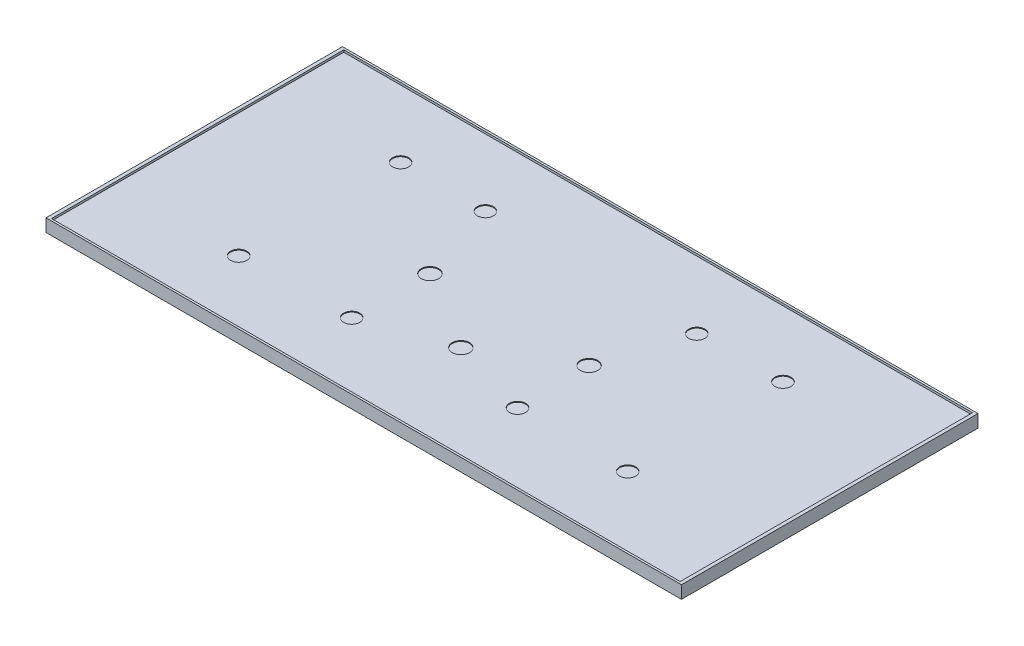
ISO-10303-21;
HEADER;
FILE_DESCRIPTION(('STEP AP214'),'2;1');
FILE_NAME('part.step','',(''),(''),'','','');
FILE_SCHEMA(('AUTOMOTIVE_DESIGN { 1 0 10303 214 1 1 1 1 }'));
ENDSEC;
DATA;
#1=APPLICATION_CONTEXT('core data for automotive mechanical design processes');
#2=APPLICATION_PROTOCOL_DEFINITION('international standard','automotive_design',2000,#1);
#3=PRODUCT_CONTEXT('',#1,'mechanical');
#4=PRODUCT('Part','Part','',(#3));
#5=PRODUCT_RELATED_PRODUCT_CATEGORY('part','',(#4));
#6=PRODUCT_DEFINITION_FORMATION('','',#4);
#7=PRODUCT_DEFINITION_CONTEXT('part definition',#1,'design');
#8=PRODUCT_DEFINITION('design','',#6,#7);
#9=PRODUCT_DEFINITION_SHAPE('','',#8);
#10=(LENGTH_UNIT() NAMED_UNIT(*) SI_UNIT(.MILLI.,.METRE.));
#11=(NAMED_UNIT(*) PLANE_ANGLE_UNIT() SI_UNIT($,.RADIAN.));
#12=(NAMED_UNIT(*) SI_UNIT($,.STERADIAN.) SOLID_ANGLE_UNIT());
#13=UNCERTAINTY_MEASURE_WITH_UNIT(LENGTH_MEASURE(1.E-05),#10,'distance_accuracy_value','');
#14=(GEOMETRIC_REPRESENTATION_CONTEXT(3) GLOBAL_UNCERTAINTY_ASSIGNED_CONTEXT((#13)) GLOBAL_UNIT_ASSIGNED_CONTEXT((#10,
#11,#12)) REPRESENTATION_CONTEXT('',''));
#15=CARTESIAN_POINT('',(0.,0.,0.));
#16=DIRECTION('',(0.,0.,1.));
#17=DIRECTION('',(1.,0.,0.));
#18=AXIS2_PLACEMENT_3D('',#15,#16,#17);
#19=CARTESIAN_POINT('',(-302.727398066436,30.,-483.03033717774));
#20=DIRECTION('',(1.,0.,0.));
#21=DIRECTION('',(0.,0.,-1.));
#22=AXIS2_PLACEMENT_3D('',#19,#20,#21);
#23=PLANE('',#22);
#24=DIRECTION('',(0.,0.,1.));
#25=VECTOR('',#24,1.);
#26=CARTESIAN_POINT('',(-302.727398066436,0.,-483.03033717774));
#27=LINE('',#26,#25);
#28=CARTESIAN_POINT('',(-302.727398066436,0.,-483.03033717774));
#29=VERTEX_POINT('',#28);
#30=CARTESIAN_POINT('',(-302.727398066436,0.,216.96966282226));
#31=VERTEX_POINT('',#30);
#32=EDGE_CURVE('E148',#29,#31,#27,.T.);
#33=ORIENTED_EDGE('',*,*,#32,.T.);
#34=DIRECTION('',(0.,-1.,0.));
#35=VECTOR('',#34,1.);
#36=CARTESIAN_POINT('',(-302.727398066436,30.,216.96966282226));
#37=LINE('',#36,#35);
#38=CARTESIAN_POINT('',(-302.727398066436,30.,216.96966282226));
#39=VERTEX_POINT('',#38);
#40=EDGE_CURVE('E11',#39,#31,#37,.T.);
#41=ORIENTED_EDGE('',*,*,#40,.F.);
#42=DIRECTION('',(0.,0.,1.));
#43=VECTOR('',#42,1.);
#44=CARTESIAN_POINT('',(-302.727398066436,30.,-483.03033717774));
#45=LINE('',#44,#43);
#46=CARTESIAN_POINT('',(-302.727398066436,30.,-483.03033717774));
#47=VERTEX_POINT('',#46);
#48=EDGE_CURVE('E152',#47,#39,#45,.T.);
#49=ORIENTED_EDGE('',*,*,#48,.F.);
#50=DIRECTION('',(0.,-1.,0.));
#51=VECTOR('',#50,1.);
#52=CARTESIAN_POINT('',(-302.727398066436,30.,-483.03033717774));
#53=LINE('',#52,#51);
#54=EDGE_CURVE('E158',#47,#29,#53,.T.);
#55=ORIENTED_EDGE('',*,*,#54,.T.);
#56=EDGE_LOOP('',(#33,#41,#49,#55));
#57=FACE_BOUND('',#56,.T.);
#58=ADVANCED_FACE('F36',(#57),#23,.F.);
#59=CARTESIAN_POINT('',(-302.727398066436,30.,216.96966282226));
#60=DIRECTION('',(0.,0.,-1.));
#61=DIRECTION('',(-1.,0.,0.));
#62=AXIS2_PLACEMENT_3D('',#59,#60,#61);
#63=PLANE('',#62);
#64=DIRECTION('',(1.,0.,0.));
#65=VECTOR('',#64,1.);
#66=CARTESIAN_POINT('',(-302.727398066436,0.,216.96966282226));
#67=LINE('',#66,#65);
#68=CARTESIAN_POINT('',(1197.27260193356,0.,216.96966282226));
#69=VERTEX_POINT('',#68);
#70=EDGE_CURVE('E161',#31,#69,#67,.T.);
#71=ORIENTED_EDGE('',*,*,#70,.T.);
#72=DIRECTION('',(0.,-1.,0.));
#73=VECTOR('',#72,1.);
#74=CARTESIAN_POINT('',(1197.27260193356,30.,216.96966282226));
#75=LINE('',#74,#73);
#76=CARTESIAN_POINT('',(1197.27260193356,30.,216.96966282226));
#77=VERTEX_POINT('',#76);
#78=EDGE_CURVE('E43',#77,#69,#75,.T.);
#79=ORIENTED_EDGE('',*,*,#78,.F.);
#80=DIRECTION('',(1.,0.,0.));
#81=VECTOR('',#80,1.);
#82=CARTESIAN_POINT('',(-302.727398066436,30.,216.96966282226));
#83=LINE('',#82,#81);
#84=EDGE_CURVE('E87',#39,#77,#83,.T.);
#85=ORIENTED_EDGE('',*,*,#84,.F.);
#86=ORIENTED_EDGE('',*,*,#40,.T.);
#87=EDGE_LOOP('',(#71,#79,#85,#86));
#88=FACE_BOUND('',#87,.T.);
#89=ADVANCED_FACE('F190',(#88),#63,.F.);
#90=CARTESIAN_POINT('',(1197.27260193356,30.,-483.03033717774));
#91=DIRECTION('',(-1.,0.,0.));
#92=DIRECTION('',(0.,0.,1.));
#93=AXIS2_PLACEMENT_3D('',#90,#91,#92);
#94=PLANE('',#93);
#95=DIRECTION('',(0.,0.,-1.));
#96=VECTOR('',#95,1.);
#97=CARTESIAN_POINT('',(1197.27260193356,0.,-483.03033717774));
#98=LINE('',#97,#96);
#99=CARTESIAN_POINT('',(1197.27260193356,0.,-483.03033717774));
#100=VERTEX_POINT('',#99);
#101=EDGE_CURVE('E163',#69,#100,#98,.T.);
#102=ORIENTED_EDGE('',*,*,#101,.T.);
#103=DIRECTION('',(0.,-1.,0.));
#104=VECTOR('',#103,1.);
#105=CARTESIAN_POINT('',(1197.27260193356,30.,-483.03033717774));
#106=LINE('',#105,#104);
#107=CARTESIAN_POINT('',(1197.27260193356,30.,-483.03033717774));
#108=VERTEX_POINT('',#107);
#109=EDGE_CURVE('E167',#108,#100,#106,.T.);
#110=ORIENTED_EDGE('',*,*,#109,.F.);
#111=DIRECTION('',(0.,0.,-1.));
#112=VECTOR('',#111,1.);
#113=CARTESIAN_POINT('',(1197.27260193356,30.,-483.03033717774));
#114=LINE('',#113,#112);
#115=EDGE_CURVE('E155',#77,#108,#114,.T.);
#116=ORIENTED_EDGE('',*,*,#115,.F.);
#117=ORIENTED_EDGE('',*,*,#78,.T.);
#118=EDGE_LOOP('',(#102,#110,#116,#117));
#119=FACE_BOUND('',#118,.T.);
#120=ADVANCED_FACE('F172',(#119),#94,.F.);
#121=CARTESIAN_POINT('',(-302.727398066436,30.,-483.03033717774));
#122=DIRECTION('',(0.,0.,1.));
#123=DIRECTION('',(1.,0.,0.));
#124=AXIS2_PLACEMENT_3D('',#121,#122,#123);
#125=PLANE('',#124);
#126=DIRECTION('',(-1.,0.,0.));
#127=VECTOR('',#126,1.);
#128=CARTESIAN_POINT('',(-302.727398066436,0.,-483.03033717774));
#129=LINE('',#128,#127);
#130=EDGE_CURVE('E80',#100,#29,#129,.T.);
#131=ORIENTED_EDGE('',*,*,#130,.T.);
#132=ORIENTED_EDGE('',*,*,#54,.F.);
#133=DIRECTION('',(-1.,0.,0.));
#134=VECTOR('',#133,1.);
#135=CARTESIAN_POINT('',(-302.727398066436,30.,-483.03033717774));
#136=LINE('',#135,#134);
#137=EDGE_CURVE('E59',#108,#47,#136,.T.);
#138=ORIENTED_EDGE('',*,*,#137,.F.);
#139=ORIENTED_EDGE('',*,*,#109,.T.);
#140=EDGE_LOOP('',(#131,#132,#138,#139));
#141=FACE_BOUND('',#140,.T.);
#142=ADVANCED_FACE('F180',(#141),#125,.F.);
#143=CARTESIAN_POINT('',(0.,30.,0.));
#144=DIRECTION('',(0.,1.,0.));
#145=DIRECTION('',(0.,0.,1.));
#146=AXIS2_PLACEMENT_3D('',#143,#144,#145);
#147=PLANE('',#146);
#148=DIRECTION('',(0.,0.,1.));
#149=VECTOR('',#148,1.);
#150=CARTESIAN_POINT('',(-294.727398066436,30.,-478.03033717774));
#151=LINE('',#150,#149);
#152=CARTESIAN_POINT('',(-294.727398066436,30.,-478.03033717774));
#153=VERTEX_POINT('',#152);
#154=CARTESIAN_POINT('',(-294.727398066436,30.,211.96966282226));
#155=VERTEX_POINT('',#154);
#156=EDGE_CURVE('E50',#153,#155,#151,.T.);
#157=ORIENTED_EDGE('',*,*,#156,.F.);
#158=DIRECTION('',(-1.,0.,0.));
#159=VECTOR('',#158,1.);
#160=CARTESIAN_POINT('',(-294.727398066436,30.,-478.03033717774));
#161=LINE('',#160,#159);
#162=CARTESIAN_POINT('',(1189.27260193356,30.,-478.03033717774));
#163=VERTEX_POINT('',#162);
#164=EDGE_CURVE('E129',#163,#153,#161,.T.);
#165=ORIENTED_EDGE('',*,*,#164,.F.);
#166=DIRECTION('',(0.,0.,-1.));
#167=VECTOR('',#166,1.);
#168=CARTESIAN_POINT('',(1189.27260193356,30.,-478.03033717774));
#169=LINE('',#168,#167);
#170=CARTESIAN_POINT('',(1189.27260193356,30.,211.96966282226));
#171=VERTEX_POINT('',#170);
#172=EDGE_CURVE('E132',#171,#163,#169,.T.);
#173=ORIENTED_EDGE('',*,*,#172,.F.);
#174=DIRECTION('',(1.,0.,0.));
#175=VECTOR('',#174,1.);
#176=CARTESIAN_POINT('',(-294.727398066436,30.,211.96966282226));
#177=LINE('',#176,#175);
#178=EDGE_CURVE('E141',#155,#171,#177,.T.);
#179=ORIENTED_EDGE('',*,*,#178,.F.);
#180=EDGE_LOOP('',(#157,#165,#173,#179));
#181=FACE_BOUND('',#180,.T.);
#182=ORIENTED_EDGE('',*,*,#48,.T.);
#183=ORIENTED_EDGE('',*,*,#84,.T.);
#184=ORIENTED_EDGE('',*,*,#115,.T.);
#185=ORIENTED_EDGE('',*,*,#137,.T.);
#186=EDGE_LOOP('',(#182,#183,#184,#185));
#187=FACE_BOUND('',#186,.T.);
#188=ADVANCED_FACE('F182',(#181,#187),#147,.T.);
#189=CARTESIAN_POINT('',(0.,0.,0.));
#190=DIRECTION('',(0.,1.,0.));
#191=DIRECTION('',(0.,0.,1.));
#192=AXIS2_PLACEMENT_3D('',#189,#190,#191);
#193=PLANE('',#192);
#194=ORIENTED_EDGE('',*,*,#32,.F.);
#195=ORIENTED_EDGE('',*,*,#130,.F.);
#196=ORIENTED_EDGE('',*,*,#101,.F.);
#197=ORIENTED_EDGE('',*,*,#70,.F.);
#198=EDGE_LOOP('',(#194,#195,#196,#197));
#199=FACE_BOUND('',#198,.T.);
#200=ADVANCED_FACE('F176',(#199),#193,.F.);
#201=CARTESIAN_POINT('',(-294.727398066436,25.,-478.03033717774));
#202=DIRECTION('',(-1.,0.,0.));
#203=DIRECTION('',(0.,0.,1.));
#204=AXIS2_PLACEMENT_3D('',#201,#202,#203);
#205=PLANE('',#204);
#206=ORIENTED_EDGE('',*,*,#156,.T.);
#207=DIRECTION('',(0.,1.,0.));
#208=VECTOR('',#207,1.);
#209=CARTESIAN_POINT('',(-294.727398066436,25.,211.96966282226));
#210=LINE('',#209,#208);
#211=CARTESIAN_POINT('',(-294.727398066436,25.,211.96966282226));
#212=VERTEX_POINT('',#211);
#213=EDGE_CURVE('E107',#212,#155,#210,.T.);
#214=ORIENTED_EDGE('',*,*,#213,.F.);
#215=DIRECTION('',(0.,0.,1.));
#216=VECTOR('',#215,1.);
#217=CARTESIAN_POINT('',(-294.727398066436,25.,-478.03033717774));
#218=LINE('',#217,#216);
#219=CARTESIAN_POINT('',(-294.727398066436,25.,-478.03033717774));
#220=VERTEX_POINT('',#219);
#221=EDGE_CURVE('E111',#220,#212,#218,.T.);
#222=ORIENTED_EDGE('',*,*,#221,.F.);
#223=DIRECTION('',(0.,1.,0.));
#224=VECTOR('',#223,1.);
#225=CARTESIAN_POINT('',(-294.727398066436,25.,-478.03033717774));
#226=LINE('',#225,#224);
#227=EDGE_CURVE('E146',#220,#153,#226,.T.);
#228=ORIENTED_EDGE('',*,*,#227,.T.);
#229=EDGE_LOOP('',(#206,#214,#222,#228));
#230=FACE_BOUND('',#229,.T.);
#231=ADVANCED_FACE('F109',(#230),#205,.F.);
#232=CARTESIAN_POINT('',(-294.727398066436,25.,-478.03033717774));
#233=DIRECTION('',(0.,0.,-1.));
#234=DIRECTION('',(-1.,0.,0.));
#235=AXIS2_PLACEMENT_3D('',#232,#233,#234);
#236=PLANE('',#235);
#237=ORIENTED_EDGE('',*,*,#164,.T.);
#238=ORIENTED_EDGE('',*,*,#227,.F.);
#239=DIRECTION('',(-1.,0.,0.));
#240=VECTOR('',#239,1.);
#241=CARTESIAN_POINT('',(-294.727398066436,25.,-478.03033717774));
#242=LINE('',#241,#240);
#243=CARTESIAN_POINT('',(1189.27260193356,25.,-478.03033717774));
#244=VERTEX_POINT('',#243);
#245=EDGE_CURVE('E117',#244,#220,#242,.T.);
#246=ORIENTED_EDGE('',*,*,#245,.F.);
#247=DIRECTION('',(0.,1.,0.));
#248=VECTOR('',#247,1.);
#249=CARTESIAN_POINT('',(1189.27260193356,25.,-478.03033717774));
#250=LINE('',#249,#248);
#251=EDGE_CURVE('E149',#244,#163,#250,.T.);
#252=ORIENTED_EDGE('',*,*,#251,.T.);
#253=EDGE_LOOP('',(#237,#238,#246,#252));
#254=FACE_BOUND('',#253,.T.);
#255=ADVANCED_FACE('F246',(#254),#236,.F.);
#256=CARTESIAN_POINT('',(1189.27260193356,25.,-478.03033717774));
#257=DIRECTION('',(1.,0.,0.));
#258=DIRECTION('',(0.,0.,-1.));
#259=AXIS2_PLACEMENT_3D('',#256,#257,#258);
#260=PLANE('',#259);
#261=ORIENTED_EDGE('',*,*,#172,.T.);
#262=ORIENTED_EDGE('',*,*,#251,.F.);
#263=DIRECTION('',(0.,0.,-1.));
#264=VECTOR('',#263,1.);
#265=CARTESIAN_POINT('',(1189.27260193356,25.,-478.03033717774));
#266=LINE('',#265,#264);
#267=CARTESIAN_POINT('',(1189.27260193356,25.,211.96966282226));
#268=VERTEX_POINT('',#267);
#269=EDGE_CURVE('E125',#268,#244,#266,.T.);
#270=ORIENTED_EDGE('',*,*,#269,.F.);
#271=DIRECTION('',(0.,1.,0.));
#272=VECTOR('',#271,1.);
#273=CARTESIAN_POINT('',(1189.27260193356,25.,211.96966282226));
#274=LINE('',#273,#272);
#275=EDGE_CURVE('E116',#268,#171,#274,.T.);
#276=ORIENTED_EDGE('',*,*,#275,.T.);
#277=EDGE_LOOP('',(#261,#262,#270,#276));
#278=FACE_BOUND('',#277,.T.);
#279=ADVANCED_FACE('F254',(#278),#260,.F.);
#280=CARTESIAN_POINT('',(-294.727398066436,25.,211.96966282226));
#281=DIRECTION('',(0.,0.,1.));
#282=DIRECTION('',(1.,0.,0.));
#283=AXIS2_PLACEMENT_3D('',#280,#281,#282);
#284=PLANE('',#283);
#285=ORIENTED_EDGE('',*,*,#178,.T.);
#286=ORIENTED_EDGE('',*,*,#275,.F.);
#287=DIRECTION('',(1.,0.,0.));
#288=VECTOR('',#287,1.);
#289=CARTESIAN_POINT('',(-294.727398066436,25.,211.96966282226));
#290=LINE('',#289,#288);
#291=EDGE_CURVE('E120',#212,#268,#290,.T.);
#292=ORIENTED_EDGE('',*,*,#291,.F.);
#293=ORIENTED_EDGE('',*,*,#213,.T.);
#294=EDGE_LOOP('',(#285,#286,#292,#293));
#295=FACE_BOUND('',#294,.T.);
#296=ADVANCED_FACE('F121',(#295),#284,.F.);
#297=CARTESIAN_POINT('',(0.,25.,0.));
#298=DIRECTION('',(0.,1.,0.));
#299=DIRECTION('',(0.,0.,1.));
#300=AXIS2_PLACEMENT_3D('',#297,#298,#299);
#301=PLANE('',#300);
#302=CARTESIAN_POINT('',(897.272601933564,25.,-322.611122669244));
#303=DIRECTION('',(0.,1.,0.));
#304=DIRECTION('',(0.,0.,1.));
#305=AXIS2_PLACEMENT_3D('',#302,#303,#304);
#306=CIRCLE('',#305,19.);
#307=CARTESIAN_POINT('',(897.272601933564,25.,-303.611122669244));
#308=VERTEX_POINT('',#307);
#309=EDGE_CURVE('E526',#308,#308,#306,.T.);
#310=ORIENTED_EDGE('',*,*,#309,.F.);
#311=EDGE_LOOP('',(#310));
#312=FACE_BOUND('',#311,.T.);
#313=CARTESIAN_POINT('',(259.572601933564,25.,-127.154489333953));
#314=DIRECTION('',(0.,1.,0.));
#315=DIRECTION('',(0.,0.,1.));
#316=AXIS2_PLACEMENT_3D('',#313,#314,#315);
#317=CIRCLE('',#316,20.5);
#318=CARTESIAN_POINT('',(259.572601933564,25.,-106.654489333953));
#319=VERTEX_POINT('',#318);
#320=EDGE_CURVE('E525',#319,#319,#317,.T.);
#321=ORIENTED_EDGE('',*,*,#320,.F.);
#322=EDGE_LOOP('',(#321));
#323=FACE_BOUND('',#322,.T.);
#324=CARTESIAN_POINT('',(-2.72739806643568,25.,61.9696628222598));
#325=DIRECTION('',(0.,1.,0.));
#326=DIRECTION('',(0.,0.,1.));
#327=AXIS2_PLACEMENT_3D('',#324,#325,#326);
#328=CIRCLE('',#327,19.);
#329=CARTESIAN_POINT('',(-2.72739806643568,25.,80.9696628222598));
#330=VERTEX_POINT('',#329);
#331=EDGE_CURVE('E596',#330,#330,#328,.T.);
#332=ORIENTED_EDGE('',*,*,#331,.F.);
#333=EDGE_LOOP('',(#332));
#334=FACE_BOUND('',#333,.T.);
#335=CARTESIAN_POINT('',(-2.72739806643574,25.,-320.105430205764));
#336=DIRECTION('',(0.,1.,0.));
#337=DIRECTION('',(0.,0.,1.));
#338=AXIS2_PLACEMENT_3D('',#335,#336,#337);
#339=CIRCLE('',#338,19.);
#340=CARTESIAN_POINT('',(-2.72739806643574,25.,-301.105430205764));
#341=VERTEX_POINT('',#340);
#342=EDGE_CURVE('E590',#341,#341,#339,.T.);
#343=ORIENTED_EDGE('',*,*,#342,.F.);
#344=EDGE_LOOP('',(#343));
#345=FACE_BOUND('',#344,.T.);
#346=CARTESIAN_POINT('',(697.300508301462,25.,-319.270199384604));
#347=DIRECTION('',(0.,1.,0.));
#348=DIRECTION('',(0.,0.,1.));
#349=AXIS2_PLACEMENT_3D('',#346,#347,#348);
#350=CIRCLE('',#349,19.);
#351=CARTESIAN_POINT('',(697.300508301462,25.,-300.270199384604));
#352=VERTEX_POINT('',#351);
#353=EDGE_CURVE('E553',#352,#352,#350,.T.);
#354=ORIENTED_EDGE('',*,*,#353,.F.);
#355=EDGE_LOOP('',(#354));
#356=FACE_BOUND('',#355,.T.);
#357=CARTESIAN_POINT('',(257.272601933564,25.,55.3776030434392));
#358=DIRECTION('',(0.,1.,0.));
#359=DIRECTION('',(0.,0.,1.));
#360=AXIS2_PLACEMENT_3D('',#357,#358,#359);
#361=CIRCLE('',#360,19.);
#362=CARTESIAN_POINT('',(257.272601933564,25.,74.3776030434392));
#363=VERTEX_POINT('',#362);
#364=EDGE_CURVE('E539',#363,#363,#361,.T.);
#365=ORIENTED_EDGE('',*,*,#364,.F.);
#366=EDGE_LOOP('',(#365));
#367=FACE_BOUND('',#366,.T.);
#368=CARTESIAN_POINT('',(637.272601933564,25.,43.8826387628666));
#369=DIRECTION('',(0.,1.,0.));
#370=DIRECTION('',(0.,0.,1.));
#371=AXIS2_PLACEMENT_3D('',#368,#369,#370);
#372=CIRCLE('',#371,19.);
#373=CARTESIAN_POINT('',(637.272601933564,25.,62.8826387628666));
#374=VERTEX_POINT('',#373);
#375=EDGE_CURVE('E540',#374,#374,#372,.T.);
#376=ORIENTED_EDGE('',*,*,#375,.F.);
#377=EDGE_LOOP('',(#376));
#378=FACE_BOUND('',#377,.T.);
#379=CARTESIAN_POINT('',(634.95492099322,25.,-127.154489333953));
#380=DIRECTION('',(0.,1.,0.));
#381=DIRECTION('',(0.,0.,1.));
#382=AXIS2_PLACEMENT_3D('',#379,#380,#381);
#383=CIRCLE('',#382,20.5000000000001);
#384=CARTESIAN_POINT('',(634.95492099322,25.,-106.654489333953));
#385=VERTEX_POINT('',#384);
#386=EDGE_CURVE('E546',#385,#385,#383,.T.);
#387=ORIENTED_EDGE('',*,*,#386,.F.);
#388=EDGE_LOOP('',(#387));
#389=FACE_BOUND('',#388,.T.);
#390=CARTESIAN_POINT('',(447.263761463392,25.,-12.3850307034069));
#391=DIRECTION('',(0.,1.,0.));
#392=DIRECTION('',(0.,0.,1.));
#393=AXIS2_PLACEMENT_3D('',#390,#391,#392);
#394=CIRCLE('',#393,20.5);
#395=CARTESIAN_POINT('',(447.263761463392,25.,8.11496929659318));
#396=VERTEX_POINT('',#395);
#397=EDGE_CURVE('E577',#396,#396,#394,.T.);
#398=ORIENTED_EDGE('',*,*,#397,.F.);
#399=EDGE_LOOP('',(#398));
#400=FACE_BOUND('',#399,.T.);
#401=CARTESIAN_POINT('',(897.272601933564,25.,43.8826387628666));
#402=DIRECTION('',(0.,1.,0.));
#403=DIRECTION('',(0.,0.,1.));
#404=AXIS2_PLACEMENT_3D('',#401,#402,#403);
#405=CIRCLE('',#404,19.);
#406=CARTESIAN_POINT('',(897.272601933564,25.,62.8826387628666));
#407=VERTEX_POINT('',#406);
#408=EDGE_CURVE('E580',#407,#407,#405,.T.);
#409=ORIENTED_EDGE('',*,*,#408,.F.);
#410=EDGE_LOOP('',(#409));
#411=FACE_BOUND('',#410,.T.);
#412=CARTESIAN_POINT('',(197.272601933564,25.,-320.105430205764));
#413=DIRECTION('',(0.,1.,0.));
#414=DIRECTION('',(0.,0.,1.));
#415=AXIS2_PLACEMENT_3D('',#412,#413,#414);
#416=CIRCLE('',#415,19.);
#417=CARTESIAN_POINT('',(197.272601933564,25.,-301.105430205764));
#418=VERTEX_POINT('',#417);
#419=EDGE_CURVE('E135',#418,#418,#416,.T.);
#420=ORIENTED_EDGE('',*,*,#419,.F.);
#421=EDGE_LOOP('',(#420));
#422=FACE_BOUND('',#421,.T.);
#423=ORIENTED_EDGE('',*,*,#221,.T.);
#424=ORIENTED_EDGE('',*,*,#291,.T.);
#425=ORIENTED_EDGE('',*,*,#269,.T.);
#426=ORIENTED_EDGE('',*,*,#245,.T.);
#427=EDGE_LOOP('',(#423,#424,#425,#426));
#428=FACE_BOUND('',#427,.T.);
#429=ADVANCED_FACE('F127',(#312,#323,#334,#345,#356,#367,#378,#389,#400,#411,#422,#428),#301,.T.);
#430=CARTESIAN_POINT('',(197.272601933564,23.,-320.105430205764));
#431=DIRECTION('',(0.,1.,0.));
#432=DIRECTION('',(0.,0.,1.));
#433=AXIS2_PLACEMENT_3D('',#430,#431,#432);
#434=CYLINDRICAL_SURFACE('',#433,19.);
#435=CARTESIAN_POINT('',(197.272601933564,23.,-320.105430205764));
#436=DIRECTION('',(0.,1.,0.));
#437=DIRECTION('',(0.,0.,1.));
#438=AXIS2_PLACEMENT_3D('',#435,#436,#437);
#439=CIRCLE('',#438,19.);
#440=CARTESIAN_POINT('',(197.272601933564,23.,-301.105430205764));
#441=VERTEX_POINT('',#440);
#442=EDGE_CURVE('E142',#441,#441,#439,.T.);
#443=ORIENTED_EDGE('',*,*,#442,.F.);
#444=EDGE_LOOP('',(#443));
#445=FACE_BOUND('',#444,.T.);
#446=ORIENTED_EDGE('',*,*,#419,.T.);
#447=EDGE_LOOP('',(#446));
#448=FACE_BOUND('',#447,.T.);
#449=ADVANCED_FACE('F278',(#445,#448),#434,.F.);
#450=CARTESIAN_POINT('',(197.272601933564,23.,-320.105430205764));
#451=DIRECTION('',(0.,1.,0.));
#452=DIRECTION('',(0.,0.,1.));
#453=AXIS2_PLACEMENT_3D('',#450,#451,#452);
#454=PLANE('',#453);
#455=ORIENTED_EDGE('',*,*,#442,.T.);
#456=EDGE_LOOP('',(#455));
#457=FACE_BOUND('',#456,.T.);
#458=ADVANCED_FACE('F287',(#457),#454,.T.);
#459=CARTESIAN_POINT('',(897.272601933564,23.,43.8826387628666));
#460=DIRECTION('',(0.,1.,0.));
#461=DIRECTION('',(0.,0.,1.));
#462=AXIS2_PLACEMENT_3D('',#459,#460,#461);
#463=CYLINDRICAL_SURFACE('',#462,19.);
#464=CARTESIAN_POINT('',(897.272601933564,23.,43.8826387628666));
#465=DIRECTION('',(0.,1.,0.));
#466=DIRECTION('',(0.,0.,1.));
#467=AXIS2_PLACEMENT_3D('',#464,#465,#466);
#468=CIRCLE('',#467,19.);
#469=CARTESIAN_POINT('',(897.272601933564,23.,62.8826387628666));
#470=VERTEX_POINT('',#469);
#471=EDGE_CURVE('E582',#470,#470,#468,.T.);
#472=ORIENTED_EDGE('',*,*,#471,.F.);
#473=EDGE_LOOP('',(#472));
#474=FACE_BOUND('',#473,.T.);
#475=ORIENTED_EDGE('',*,*,#408,.T.);
#476=EDGE_LOOP('',(#475));
#477=FACE_BOUND('',#476,.T.);
#478=ADVANCED_FACE('F296',(#474,#477),#463,.F.);
#479=CARTESIAN_POINT('',(897.272601933564,23.,43.8826387628666));
#480=DIRECTION('',(0.,1.,0.));
#481=DIRECTION('',(0.,0.,1.));
#482=AXIS2_PLACEMENT_3D('',#479,#480,#481);
#483=PLANE('',#482);
#484=ORIENTED_EDGE('',*,*,#471,.T.);
#485=EDGE_LOOP('',(#484));
#486=FACE_BOUND('',#485,.T.);
#487=ADVANCED_FACE('F305',(#486),#483,.T.);
#488=CARTESIAN_POINT('',(447.263761463392,23.,-12.3850307034069));
#489=DIRECTION('',(0.,1.,0.));
#490=DIRECTION('',(0.,0.,1.));
#491=AXIS2_PLACEMENT_3D('',#488,#489,#490);
#492=CYLINDRICAL_SURFACE('',#491,20.5);
#493=CARTESIAN_POINT('',(447.263761463392,23.,-12.3850307034069));
#494=DIRECTION('',(0.,1.,0.));
#495=DIRECTION('',(0.,0.,1.));
#496=AXIS2_PLACEMENT_3D('',#493,#494,#495);
#497=CIRCLE('',#496,20.5);
#498=CARTESIAN_POINT('',(447.263761463392,23.,8.11496929659318));
#499=VERTEX_POINT('',#498);
#500=EDGE_CURVE('E532',#499,#499,#497,.T.);
#501=ORIENTED_EDGE('',*,*,#500,.F.);
#502=EDGE_LOOP('',(#501));
#503=FACE_BOUND('',#502,.T.);
#504=ORIENTED_EDGE('',*,*,#397,.T.);
#505=EDGE_LOOP('',(#504));
#506=FACE_BOUND('',#505,.T.);
#507=ADVANCED_FACE('F314',(#503,#506),#492,.F.);
#508=CARTESIAN_POINT('',(447.263761463392,23.,-12.3850307034069));
#509=DIRECTION('',(0.,1.,0.));
#510=DIRECTION('',(0.,0.,1.));
#511=AXIS2_PLACEMENT_3D('',#508,#509,#510);
#512=PLANE('',#511);
#513=ORIENTED_EDGE('',*,*,#500,.T.);
#514=EDGE_LOOP('',(#513));
#515=FACE_BOUND('',#514,.T.);
#516=ADVANCED_FACE('F323',(#515),#512,.T.);
#517=CARTESIAN_POINT('',(634.95492099322,23.,-127.154489333953));
#518=DIRECTION('',(0.,1.,0.));
#519=DIRECTION('',(0.,0.,1.));
#520=AXIS2_PLACEMENT_3D('',#517,#518,#519);
#521=CYLINDRICAL_SURFACE('',#520,20.5000000000001);
#522=CARTESIAN_POINT('',(634.95492099322,23.,-127.154489333953));
#523=DIRECTION('',(0.,1.,0.));
#524=DIRECTION('',(0.,0.,1.));
#525=AXIS2_PLACEMENT_3D('',#522,#523,#524);
#526=CIRCLE('',#525,20.5000000000001);
#527=CARTESIAN_POINT('',(634.95492099322,23.,-106.654489333953));
#528=VERTEX_POINT('',#527);
#529=EDGE_CURVE('E543',#528,#528,#526,.T.);
#530=ORIENTED_EDGE('',*,*,#529,.F.);
#531=EDGE_LOOP('',(#530));
#532=FACE_BOUND('',#531,.T.);
#533=ORIENTED_EDGE('',*,*,#386,.T.);
#534=EDGE_LOOP('',(#533));
#535=FACE_BOUND('',#534,.T.);
#536=ADVANCED_FACE('F332',(#532,#535),#521,.F.);
#537=CARTESIAN_POINT('',(634.95492099322,23.,-127.154489333953));
#538=DIRECTION('',(0.,1.,0.));
#539=DIRECTION('',(0.,0.,1.));
#540=AXIS2_PLACEMENT_3D('',#537,#538,#539);
#541=PLANE('',#540);
#542=ORIENTED_EDGE('',*,*,#529,.T.);
#543=EDGE_LOOP('',(#542));
#544=FACE_BOUND('',#543,.T.);
#545=ADVANCED_FACE('F341',(#544),#541,.T.);
#546=CARTESIAN_POINT('',(637.272601933564,23.,43.8826387628666));
#547=DIRECTION('',(0.,1.,0.));
#548=DIRECTION('',(0.,0.,1.));
#549=AXIS2_PLACEMENT_3D('',#546,#547,#548);
#550=CYLINDRICAL_SURFACE('',#549,19.);
#551=CARTESIAN_POINT('',(637.272601933564,23.,43.8826387628666));
#552=DIRECTION('',(0.,1.,0.));
#553=DIRECTION('',(0.,0.,1.));
#554=AXIS2_PLACEMENT_3D('',#551,#552,#553);
#555=CIRCLE('',#554,19.);
#556=CARTESIAN_POINT('',(637.272601933564,23.,62.8826387628666));
#557=VERTEX_POINT('',#556);
#558=EDGE_CURVE('E536',#557,#557,#555,.T.);
#559=ORIENTED_EDGE('',*,*,#558,.F.);
#560=EDGE_LOOP('',(#559));
#561=FACE_BOUND('',#560,.T.);
#562=ORIENTED_EDGE('',*,*,#375,.T.);
#563=EDGE_LOOP('',(#562));
#564=FACE_BOUND('',#563,.T.);
#565=ADVANCED_FACE('F350',(#561,#564),#550,.F.);
#566=CARTESIAN_POINT('',(637.272601933564,23.,43.8826387628666));
#567=DIRECTION('',(0.,1.,0.));
#568=DIRECTION('',(0.,0.,1.));
#569=AXIS2_PLACEMENT_3D('',#566,#567,#568);
#570=PLANE('',#569);
#571=ORIENTED_EDGE('',*,*,#558,.T.);
#572=EDGE_LOOP('',(#571));
#573=FACE_BOUND('',#572,.T.);
#574=ADVANCED_FACE('F359',(#573),#570,.T.);
#575=CARTESIAN_POINT('',(257.272601933564,23.,55.3776030434392));
#576=DIRECTION('',(0.,1.,0.));
#577=DIRECTION('',(0.,0.,1.));
#578=AXIS2_PLACEMENT_3D('',#575,#576,#577);
#579=CYLINDRICAL_SURFACE('',#578,19.);
#580=CARTESIAN_POINT('',(257.272601933564,23.,55.3776030434392));
#581=DIRECTION('',(0.,1.,0.));
#582=DIRECTION('',(0.,0.,1.));
#583=AXIS2_PLACEMENT_3D('',#580,#581,#582);
#584=CIRCLE('',#583,19.);
#585=CARTESIAN_POINT('',(257.272601933564,23.,74.3776030434392));
#586=VERTEX_POINT('',#585);
#587=EDGE_CURVE('E556',#586,#586,#584,.T.);
#588=ORIENTED_EDGE('',*,*,#587,.F.);
#589=EDGE_LOOP('',(#588));
#590=FACE_BOUND('',#589,.T.);
#591=ORIENTED_EDGE('',*,*,#364,.T.);
#592=EDGE_LOOP('',(#591));
#593=FACE_BOUND('',#592,.T.);
#594=ADVANCED_FACE('F368',(#590,#593),#579,.F.);
#595=CARTESIAN_POINT('',(257.272601933564,23.,55.3776030434392));
#596=DIRECTION('',(0.,1.,0.));
#597=DIRECTION('',(0.,0.,1.));
#598=AXIS2_PLACEMENT_3D('',#595,#596,#597);
#599=PLANE('',#598);
#600=ORIENTED_EDGE('',*,*,#587,.T.);
#601=EDGE_LOOP('',(#600));
#602=FACE_BOUND('',#601,.T.);
#603=ADVANCED_FACE('F377',(#602),#599,.T.);
#604=CARTESIAN_POINT('',(697.300508301462,23.,-319.270199384604));
#605=DIRECTION('',(0.,1.,0.));
#606=DIRECTION('',(0.,0.,1.));
#607=AXIS2_PLACEMENT_3D('',#604,#605,#606);
#608=CYLINDRICAL_SURFACE('',#607,19.);
#609=CARTESIAN_POINT('',(697.300508301462,23.,-319.270199384604));
#610=DIRECTION('',(0.,1.,0.));
#611=DIRECTION('',(0.,0.,1.));
#612=AXIS2_PLACEMENT_3D('',#609,#610,#611);
#613=CIRCLE('',#612,19.);
#614=CARTESIAN_POINT('',(697.300508301462,23.,-300.270199384604));
#615=VERTEX_POINT('',#614);
#616=EDGE_CURVE('E550',#615,#615,#613,.T.);
#617=ORIENTED_EDGE('',*,*,#616,.F.);
#618=EDGE_LOOP('',(#617));
#619=FACE_BOUND('',#618,.T.);
#620=ORIENTED_EDGE('',*,*,#353,.T.);
#621=EDGE_LOOP('',(#620));
#622=FACE_BOUND('',#621,.T.);
#623=ADVANCED_FACE('F386',(#619,#622),#608,.F.);
#624=CARTESIAN_POINT('',(697.300508301462,23.,-319.270199384604));
#625=DIRECTION('',(0.,1.,0.));
#626=DIRECTION('',(0.,0.,1.));
#627=AXIS2_PLACEMENT_3D('',#624,#625,#626);
#628=PLANE('',#627);
#629=ORIENTED_EDGE('',*,*,#616,.T.);
#630=EDGE_LOOP('',(#629));
#631=FACE_BOUND('',#630,.T.);
#632=ADVANCED_FACE('F395',(#631),#628,.T.);
#633=CARTESIAN_POINT('',(-2.72739806643574,23.,-320.105430205764));
#634=DIRECTION('',(0.,1.,0.));
#635=DIRECTION('',(0.,0.,1.));
#636=AXIS2_PLACEMENT_3D('',#633,#634,#635);
#637=CYLINDRICAL_SURFACE('',#636,19.);
#638=CARTESIAN_POINT('',(-2.72739806643574,23.,-320.105430205764));
#639=DIRECTION('',(0.,1.,0.));
#640=DIRECTION('',(0.,0.,1.));
#641=AXIS2_PLACEMENT_3D('',#638,#639,#640);
#642=CIRCLE('',#641,19.);
#643=CARTESIAN_POINT('',(-2.72739806643574,23.,-301.105430205764));
#644=VERTEX_POINT('',#643);
#645=EDGE_CURVE('E549',#644,#644,#642,.T.);
#646=ORIENTED_EDGE('',*,*,#645,.F.);
#647=EDGE_LOOP('',(#646));
#648=FACE_BOUND('',#647,.T.);
#649=ORIENTED_EDGE('',*,*,#342,.T.);
#650=EDGE_LOOP('',(#649));
#651=FACE_BOUND('',#650,.T.);
#652=ADVANCED_FACE('F404',(#648,#651),#637,.F.);
#653=CARTESIAN_POINT('',(-2.72739806643574,23.,-320.105430205764));
#654=DIRECTION('',(0.,1.,0.));
#655=DIRECTION('',(0.,0.,1.));
#656=AXIS2_PLACEMENT_3D('',#653,#654,#655);
#657=PLANE('',#656);
#658=ORIENTED_EDGE('',*,*,#645,.T.);
#659=EDGE_LOOP('',(#658));
#660=FACE_BOUND('',#659,.T.);
#661=ADVANCED_FACE('F413',(#660),#657,.T.);
#662=CARTESIAN_POINT('',(-2.72739806643568,23.,61.9696628222598));
#663=DIRECTION('',(0.,1.,0.));
#664=DIRECTION('',(0.,0.,1.));
#665=AXIS2_PLACEMENT_3D('',#662,#663,#664);
#666=CYLINDRICAL_SURFACE('',#665,19.);
#667=CARTESIAN_POINT('',(-2.72739806643568,23.,61.9696628222598));
#668=DIRECTION('',(0.,1.,0.));
#669=DIRECTION('',(0.,0.,1.));
#670=AXIS2_PLACEMENT_3D('',#667,#668,#669);
#671=CIRCLE('',#670,19.);
#672=CARTESIAN_POINT('',(-2.72739806643568,23.,80.9696628222598));
#673=VERTEX_POINT('',#672);
#674=EDGE_CURVE('E593',#673,#673,#671,.T.);
#675=ORIENTED_EDGE('',*,*,#674,.F.);
#676=EDGE_LOOP('',(#675));
#677=FACE_BOUND('',#676,.T.);
#678=ORIENTED_EDGE('',*,*,#331,.T.);
#679=EDGE_LOOP('',(#678));
#680=FACE_BOUND('',#679,.T.);
#681=ADVANCED_FACE('F422',(#677,#680),#666,.F.);
#682=CARTESIAN_POINT('',(-2.72739806643568,23.,61.9696628222598));
#683=DIRECTION('',(0.,1.,0.));
#684=DIRECTION('',(0.,0.,1.));
#685=AXIS2_PLACEMENT_3D('',#682,#683,#684);
#686=PLANE('',#685);
#687=ORIENTED_EDGE('',*,*,#674,.T.);
#688=EDGE_LOOP('',(#687));
#689=FACE_BOUND('',#688,.T.);
#690=ADVANCED_FACE('F431',(#689),#686,.T.);
#691=CARTESIAN_POINT('',(259.572601933564,23.,-127.154489333953));
#692=DIRECTION('',(0.,1.,0.));
#693=DIRECTION('',(0.,0.,1.));
#694=AXIS2_PLACEMENT_3D('',#691,#692,#693);
#695=CYLINDRICAL_SURFACE('',#694,20.5);
#696=CARTESIAN_POINT('',(259.572601933564,23.,-127.154489333953));
#697=DIRECTION('',(0.,1.,0.));
#698=DIRECTION('',(0.,0.,1.));
#699=AXIS2_PLACEMENT_3D('',#696,#697,#698);
#700=CIRCLE('',#699,20.5);
#701=CARTESIAN_POINT('',(259.572601933564,23.,-106.654489333953));
#702=VERTEX_POINT('',#701);
#703=EDGE_CURVE('E529',#702,#702,#700,.T.);
#704=ORIENTED_EDGE('',*,*,#703,.F.);
#705=EDGE_LOOP('',(#704));
#706=FACE_BOUND('',#705,.T.);
#707=ORIENTED_EDGE('',*,*,#320,.T.);
#708=EDGE_LOOP('',(#707));
#709=FACE_BOUND('',#708,.T.);
#710=ADVANCED_FACE('F440',(#706,#709),#695,.F.);
#711=CARTESIAN_POINT('',(259.572601933564,23.,-127.154489333953));
#712=DIRECTION('',(0.,1.,0.));
#713=DIRECTION('',(0.,0.,1.));
#714=AXIS2_PLACEMENT_3D('',#711,#712,#713);
#715=PLANE('',#714);
#716=ORIENTED_EDGE('',*,*,#703,.T.);
#717=EDGE_LOOP('',(#716));
#718=FACE_BOUND('',#717,.T.);
#719=ADVANCED_FACE('F449',(#718),#715,.T.);
#720=CARTESIAN_POINT('',(897.272601933564,23.,-322.611122669244));
#721=DIRECTION('',(0.,1.,0.));
#722=DIRECTION('',(0.,0.,1.));
#723=AXIS2_PLACEMENT_3D('',#720,#721,#722);
#724=CYLINDRICAL_SURFACE('',#723,19.);
#725=CARTESIAN_POINT('',(897.272601933564,23.,-322.611122669244));
#726=DIRECTION('',(0.,1.,0.));
#727=DIRECTION('',(0.,0.,1.));
#728=AXIS2_PLACEMENT_3D('',#725,#726,#727);
#729=CIRCLE('',#728,19.);
#730=CARTESIAN_POINT('',(897.272601933564,23.,-303.611122669244));
#731=VERTEX_POINT('',#730);
#732=EDGE_CURVE('E524',#731,#731,#729,.T.);
#733=ORIENTED_EDGE('',*,*,#732,.F.);
#734=EDGE_LOOP('',(#733));
#735=FACE_BOUND('',#734,.T.);
#736=ORIENTED_EDGE('',*,*,#309,.T.);
#737=EDGE_LOOP('',(#736));
#738=FACE_BOUND('',#737,.T.);
#739=ADVANCED_FACE('F458',(#735,#738),#724,.F.);
#740=CARTESIAN_POINT('',(897.272601933564,23.,-322.611122669244));
#741=DIRECTION('',(0.,1.,0.));
#742=DIRECTION('',(0.,0.,1.));
#743=AXIS2_PLACEMENT_3D('',#740,#741,#742);
#744=PLANE('',#743);
#745=ORIENTED_EDGE('',*,*,#732,.T.);
#746=EDGE_LOOP('',(#745));
#747=FACE_BOUND('',#746,.T.);
#748=ADVANCED_FACE('F467',(#747),#744,.T.);
#749=CLOSED_SHELL('',(#58,#89,#120,#142,#188,#200,#231,#255,#279,#296,#429,#449,#458,#478,#487,
#507,#516,#536,#545,#565,#574,#594,#603,#623,#632,#652,#661,#681,#690,#710,#719,#739,#748));
#750=MANIFOLD_SOLID_BREP('B2',#749);
#751=ADVANCED_BREP_SHAPE_REPRESENTATION('',(#18,#750),#14);
#752=SHAPE_DEFINITION_REPRESENTATION(#9,#751);
ENDSEC;
END-ISO-10303-21;
